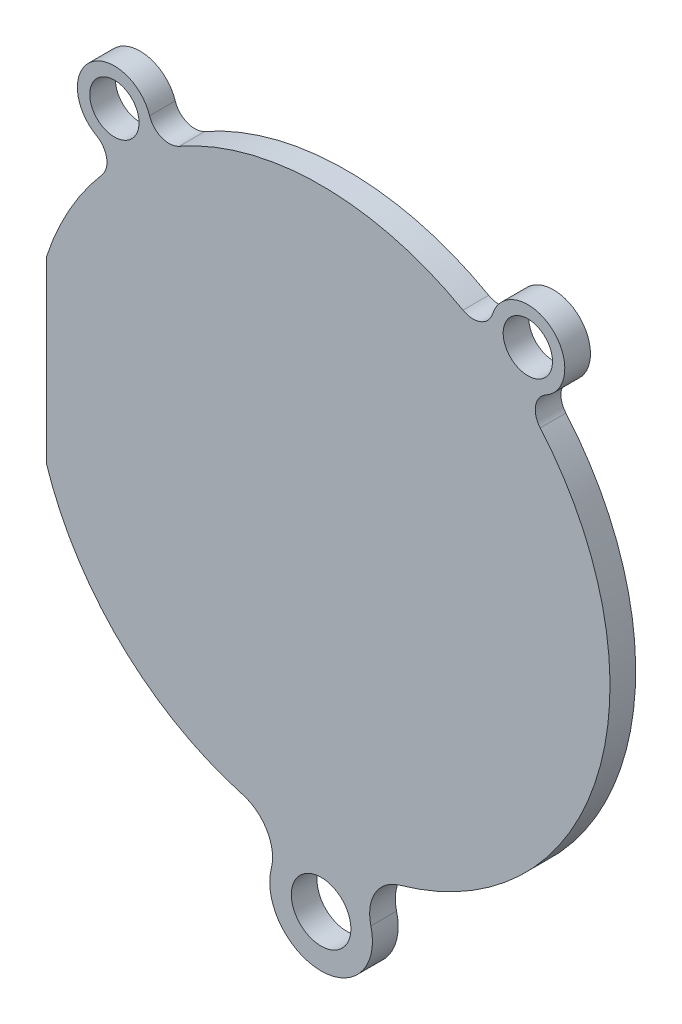
ISO-10303-21;
HEADER;
FILE_DESCRIPTION(('STEP AP214'),'2;1');
FILE_NAME('part.step','',(''),(''),'','','');
FILE_SCHEMA(('AUTOMOTIVE_DESIGN { 1 0 10303 214 1 1 1 1 }'));
ENDSEC;
DATA;
#1=APPLICATION_CONTEXT('core data for automotive mechanical design processes');
#2=APPLICATION_PROTOCOL_DEFINITION('international standard','automotive_design',2000,#1);
#3=PRODUCT_CONTEXT('',#1,'mechanical');
#4=PRODUCT('Part','Part','',(#3));
#5=PRODUCT_RELATED_PRODUCT_CATEGORY('part','',(#4));
#6=PRODUCT_DEFINITION_FORMATION('','',#4);
#7=PRODUCT_DEFINITION_CONTEXT('part definition',#1,'design');
#8=PRODUCT_DEFINITION('design','',#6,#7);
#9=PRODUCT_DEFINITION_SHAPE('','',#8);
#10=(LENGTH_UNIT() NAMED_UNIT(*) SI_UNIT(.MILLI.,.METRE.));
#11=(NAMED_UNIT(*) PLANE_ANGLE_UNIT() SI_UNIT($,.RADIAN.));
#12=(NAMED_UNIT(*) SI_UNIT($,.STERADIAN.) SOLID_ANGLE_UNIT());
#13=UNCERTAINTY_MEASURE_WITH_UNIT(LENGTH_MEASURE(1.E-05),#10,'distance_accuracy_value','');
#14=(GEOMETRIC_REPRESENTATION_CONTEXT(3) GLOBAL_UNCERTAINTY_ASSIGNED_CONTEXT((#13)) GLOBAL_UNIT_ASSIGNED_CONTEXT((#10,
#11,#12)) REPRESENTATION_CONTEXT('',''));
#15=CARTESIAN_POINT('',(0.,0.,0.));
#16=DIRECTION('',(0.,0.,1.));
#17=DIRECTION('',(1.,0.,0.));
#18=AXIS2_PLACEMENT_3D('',#15,#16,#17);
#19=CARTESIAN_POINT('',(-14.509445468443,12.4672192211281,1.5875));
#20=DIRECTION('',(0.,0.,1.));
#21=DIRECTION('',(1.,0.,0.));
#22=AXIS2_PLACEMENT_3D('',#19,#20,#21);
#23=PLANE('',#22);
#24=CARTESIAN_POINT('',(-12.7793395932632,15.5739650524873,1.5875));
#25=DIRECTION('',(0.,0.,1.));
#26=DIRECTION('',(1.,0.,0.));
#27=AXIS2_PLACEMENT_3D('',#24,#25,#26);
#28=CIRCLE('',#27,1.524);
#29=CARTESIAN_POINT('',(-11.2553395932632,15.5739650524873,1.5875));
#30=VERTEX_POINT('',#29);
#31=EDGE_CURVE('E313',#30,#30,#28,.T.);
#32=ORIENTED_EDGE('',*,*,#31,.F.);
#33=EDGE_LOOP('',(#32));
#34=FACE_BOUND('',#33,.T.);
#35=CARTESIAN_POINT('',(-14.509445468443,12.4672192211281,1.5875));
#36=DIRECTION('',(0.,0.,-1.));
#37=DIRECTION('',(1.,0.,0.));
#38=AXIS2_PLACEMENT_3D('',#35,#36,#37);
#39=CIRCLE('',#38,1.27);
#40=CARTESIAN_POINT('',(-13.8915505130217,13.5767713037564,1.5875));
#41=VERTEX_POINT('',#40);
#42=CARTESIAN_POINT('',(-13.5461924936276,11.639545549619,1.5875));
#43=VERTEX_POINT('',#42);
#44=EDGE_CURVE('E193',#41,#43,#39,.T.);
#45=ORIENTED_EDGE('',*,*,#44,.T.);
#46=CARTESIAN_POINT('',(0.,0.,1.5875));
#47=DIRECTION('',(0.,0.,1.));
#48=DIRECTION('',(1.,0.,0.));
#49=AXIS2_PLACEMENT_3D('',#46,#47,#48);
#50=CIRCLE('',#49,17.8599650524873);
#51=CARTESIAN_POINT('',(-16.9840587441892,5.5245,1.5875));
#52=VERTEX_POINT('',#51);
#53=EDGE_CURVE('E111',#43,#52,#50,.T.);
#54=ORIENTED_EDGE('',*,*,#53,.T.);
#55=DIRECTION('',(0.,-1.,0.));
#56=VECTOR('',#55,1.);
#57=CARTESIAN_POINT('',(-16.9840587441893,-5.52449999999963,1.5875));
#58=LINE('',#57,#56);
#59=CARTESIAN_POINT('',(-16.9840587441893,-5.52449999999963,1.5875));
#60=VERTEX_POINT('',#59);
#61=EDGE_CURVE('E226',#52,#60,#58,.T.);
#62=ORIENTED_EDGE('',*,*,#61,.T.);
#63=CARTESIAN_POINT('',(0.,0.,1.5875));
#64=DIRECTION('',(0.,0.,1.));
#65=DIRECTION('',(1.,0.,0.));
#66=AXIS2_PLACEMENT_3D('',#63,#64,#65);
#67=CIRCLE('',#66,17.8599650524873);
#68=CARTESIAN_POINT('',(-4.85058295667171,-17.1886647723584,1.5875));
#69=VERTEX_POINT('',#68);
#70=EDGE_CURVE('E245',#60,#69,#67,.T.);
#71=ORIENTED_EDGE('',*,*,#70,.T.);
#72=CARTESIAN_POINT('',(-5.54042085242001,-19.6331941089771,1.5875));
#73=DIRECTION('',(0.,0.,-1.));
#74=DIRECTION('',(1.,0.,0.));
#75=AXIS2_PLACEMENT_3D('',#72,#73,#74);
#76=CIRCLE('',#75,2.54);
#77=CARTESIAN_POINT('',(-3.07801158467778,-20.2562034172039,1.5875));
#78=VERTEX_POINT('',#77);
#79=EDGE_CURVE('E242',#69,#78,#76,.T.);
#80=ORIENTED_EDGE('',*,*,#79,.T.);
#81=CARTESIAN_POINT('',(0.,-21.0349650524873,1.5875));
#82=DIRECTION('',(0.,0.,1.));
#83=DIRECTION('',(1.,0.,0.));
#84=AXIS2_PLACEMENT_3D('',#81,#82,#83);
#85=CIRCLE('',#84,3.175);
#86=CARTESIAN_POINT('',(3.07801158467779,-20.2562034172039,1.5875));
#87=VERTEX_POINT('',#86);
#88=EDGE_CURVE('E244',#78,#87,#85,.T.);
#89=ORIENTED_EDGE('',*,*,#88,.T.);
#90=CARTESIAN_POINT('',(5.54042085242001,-19.6331941089771,1.5875));
#91=DIRECTION('',(0.,0.,-1.));
#92=DIRECTION('',(1.,0.,0.));
#93=AXIS2_PLACEMENT_3D('',#90,#91,#92);
#94=CIRCLE('',#93,2.54);
#95=CARTESIAN_POINT('',(4.85058295667171,-17.1886647723584,1.5875));
#96=VERTEX_POINT('',#95);
#97=EDGE_CURVE('E247',#87,#96,#94,.T.);
#98=ORIENTED_EDGE('',*,*,#97,.T.);
#99=CARTESIAN_POINT('',(0.,0.,1.5875));
#100=DIRECTION('',(0.,0.,1.));
#101=DIRECTION('',(1.,0.,0.));
#102=AXIS2_PLACEMENT_3D('',#99,#100,#101);
#103=CIRCLE('',#102,17.8599650524873);
#104=CARTESIAN_POINT('',(13.5461924936276,11.639545549619,1.5875));
#105=VERTEX_POINT('',#104);
#106=EDGE_CURVE('E253',#96,#105,#103,.T.);
#107=ORIENTED_EDGE('',*,*,#106,.T.);
#108=CARTESIAN_POINT('',(14.509445468443,12.4672192211281,1.5875));
#109=DIRECTION('',(0.,0.,-1.));
#110=DIRECTION('',(1.,0.,0.));
#111=AXIS2_PLACEMENT_3D('',#108,#109,#110);
#112=CIRCLE('',#111,1.27);
#113=CARTESIAN_POINT('',(13.8915505130217,13.5767713037564,1.5875));
#114=VERTEX_POINT('',#113);
#115=EDGE_CURVE('E255',#105,#114,#112,.T.);
#116=ORIENTED_EDGE('',*,*,#115,.T.);
#117=CARTESIAN_POINT('',(12.7793395932632,15.5739650524873,1.5875));
#118=DIRECTION('',(0.,0.,1.));
#119=DIRECTION('',(1.,0.,0.));
#120=AXIS2_PLACEMENT_3D('',#117,#118,#119);
#121=CIRCLE('',#120,2.286);
#122=CARTESIAN_POINT('',(10.6034384604149,16.2748575264587,1.5875));
#123=VERTEX_POINT('',#122);
#124=EDGE_CURVE('E257',#114,#123,#121,.T.);
#125=ORIENTED_EDGE('',*,*,#124,.T.);
#126=CARTESIAN_POINT('',(9.39460449772145,16.6642422342205,1.5875));
#127=DIRECTION('',(0.,0.,-1.));
#128=DIRECTION('',(1.,0.,0.));
#129=AXIS2_PLACEMENT_3D('',#126,#127,#128);
#130=CIRCLE('',#129,1.27);
#131=CARTESIAN_POINT('',(8.77091555321107,15.5579366252247,1.5875));
#132=VERTEX_POINT('',#131);
#133=EDGE_CURVE('E148',#123,#132,#130,.T.);
#134=ORIENTED_EDGE('',*,*,#133,.T.);
#135=CARTESIAN_POINT('',(0.,0.,1.5875));
#136=DIRECTION('',(0.,0.,1.));
#137=DIRECTION('',(1.,0.,0.));
#138=AXIS2_PLACEMENT_3D('',#135,#136,#137);
#139=CIRCLE('',#138,17.8599650524873);
#140=CARTESIAN_POINT('',(-8.77091555321107,15.5579366252247,1.5875));
#141=VERTEX_POINT('',#140);
#142=EDGE_CURVE('E142',#132,#141,#139,.T.);
#143=ORIENTED_EDGE('',*,*,#142,.T.);
#144=CARTESIAN_POINT('',(-9.39460449772145,16.6642422342205,1.5875));
#145=DIRECTION('',(0.,0.,-1.));
#146=DIRECTION('',(1.,0.,0.));
#147=AXIS2_PLACEMENT_3D('',#144,#145,#146);
#148=CIRCLE('',#147,1.27);
#149=CARTESIAN_POINT('',(-10.6034384604149,16.2748575264587,1.5875));
#150=VERTEX_POINT('',#149);
#151=EDGE_CURVE('E146',#141,#150,#148,.T.);
#152=ORIENTED_EDGE('',*,*,#151,.T.);
#153=CARTESIAN_POINT('',(-12.7793395932632,15.5739650524873,1.5875));
#154=DIRECTION('',(0.,0.,1.));
#155=DIRECTION('',(1.,0.,0.));
#156=AXIS2_PLACEMENT_3D('',#153,#154,#155);
#157=CIRCLE('',#156,2.286);
#158=EDGE_CURVE('E50',#150,#41,#157,.T.);
#159=ORIENTED_EDGE('',*,*,#158,.T.);
#160=EDGE_LOOP('',(#45,#54,#62,#71,#80,#89,#98,#107,#116,#125,#134,#143,#152,#159));
#161=FACE_BOUND('',#160,.T.);
#162=CARTESIAN_POINT('',(0.,-21.0349650524873,1.5875));
#163=DIRECTION('',(0.,0.,1.));
#164=DIRECTION('',(1.,0.,0.));
#165=AXIS2_PLACEMENT_3D('',#162,#163,#164);
#166=CIRCLE('',#165,1.8415);
#167=CARTESIAN_POINT('',(1.8415,-21.0349650524873,1.5875));
#168=VERTEX_POINT('',#167);
#169=EDGE_CURVE('E170',#168,#168,#166,.T.);
#170=ORIENTED_EDGE('',*,*,#169,.F.);
#171=EDGE_LOOP('',(#170));
#172=FACE_BOUND('',#171,.T.);
#173=CARTESIAN_POINT('',(12.7793395932632,15.5739650524873,1.5875));
#174=DIRECTION('',(0.,0.,1.));
#175=DIRECTION('',(1.,0.,0.));
#176=AXIS2_PLACEMENT_3D('',#173,#174,#175);
#177=CIRCLE('',#176,1.524);
#178=CARTESIAN_POINT('',(14.3033395932632,15.5739650524873,1.5875));
#179=VERTEX_POINT('',#178);
#180=EDGE_CURVE('E304',#179,#179,#177,.T.);
#181=ORIENTED_EDGE('',*,*,#180,.F.);
#182=EDGE_LOOP('',(#181));
#183=FACE_BOUND('',#182,.T.);
#184=ADVANCED_FACE('F33',(#34,#161,#172,#183),#23,.T.);
#185=CARTESIAN_POINT('',(-14.509445468443,12.4672192211281,0.));
#186=DIRECTION('',(0.,0.,1.));
#187=DIRECTION('',(1.,0.,0.));
#188=AXIS2_PLACEMENT_3D('',#185,#186,#187);
#189=PLANE('',#188);
#190=CARTESIAN_POINT('',(-12.7793395932632,15.5739650524873,0.));
#191=DIRECTION('',(0.,0.,1.));
#192=DIRECTION('',(1.,0.,0.));
#193=AXIS2_PLACEMENT_3D('',#190,#191,#192);
#194=CIRCLE('',#193,1.524);
#195=CARTESIAN_POINT('',(-11.2553395932632,15.5739650524873,0.));
#196=VERTEX_POINT('',#195);
#197=EDGE_CURVE('E310',#196,#196,#194,.T.);
#198=ORIENTED_EDGE('',*,*,#197,.T.);
#199=EDGE_LOOP('',(#198));
#200=FACE_BOUND('',#199,.T.);
#201=CARTESIAN_POINT('',(-14.509445468443,12.4672192211281,0.));
#202=DIRECTION('',(0.,0.,-1.));
#203=DIRECTION('',(1.,0.,0.));
#204=AXIS2_PLACEMENT_3D('',#201,#202,#203);
#205=CIRCLE('',#204,1.27);
#206=CARTESIAN_POINT('',(-13.8915505130217,13.5767713037564,0.));
#207=VERTEX_POINT('',#206);
#208=CARTESIAN_POINT('',(-13.5461924936276,11.639545549619,0.));
#209=VERTEX_POINT('',#208);
#210=EDGE_CURVE('E166',#207,#209,#205,.T.);
#211=ORIENTED_EDGE('',*,*,#210,.F.);
#212=CARTESIAN_POINT('',(-12.7793395932632,15.5739650524873,0.));
#213=DIRECTION('',(0.,0.,1.));
#214=DIRECTION('',(1.,0.,0.));
#215=AXIS2_PLACEMENT_3D('',#212,#213,#214);
#216=CIRCLE('',#215,2.286);
#217=CARTESIAN_POINT('',(-10.6034384604149,16.2748575264587,0.));
#218=VERTEX_POINT('',#217);
#219=EDGE_CURVE('E103',#218,#207,#216,.T.);
#220=ORIENTED_EDGE('',*,*,#219,.F.);
#221=CARTESIAN_POINT('',(-9.39460449772145,16.6642422342205,0.));
#222=DIRECTION('',(0.,0.,-1.));
#223=DIRECTION('',(1.,0.,0.));
#224=AXIS2_PLACEMENT_3D('',#221,#222,#223);
#225=CIRCLE('',#224,1.27);
#226=CARTESIAN_POINT('',(-8.77091555321107,15.5579366252247,0.));
#227=VERTEX_POINT('',#226);
#228=EDGE_CURVE('E97',#227,#218,#225,.T.);
#229=ORIENTED_EDGE('',*,*,#228,.F.);
#230=CARTESIAN_POINT('',(0.,0.,0.));
#231=DIRECTION('',(0.,0.,1.));
#232=DIRECTION('',(1.,0.,0.));
#233=AXIS2_PLACEMENT_3D('',#230,#231,#232);
#234=CIRCLE('',#233,17.8599650524873);
#235=CARTESIAN_POINT('',(8.77091555321107,15.5579366252247,0.));
#236=VERTEX_POINT('',#235);
#237=EDGE_CURVE('E156',#236,#227,#234,.T.);
#238=ORIENTED_EDGE('',*,*,#237,.F.);
#239=CARTESIAN_POINT('',(9.39460449772145,16.6642422342205,0.));
#240=DIRECTION('',(0.,0.,-1.));
#241=DIRECTION('',(1.,0.,0.));
#242=AXIS2_PLACEMENT_3D('',#239,#240,#241);
#243=CIRCLE('',#242,1.27);
#244=CARTESIAN_POINT('',(10.6034384604149,16.2748575264587,0.));
#245=VERTEX_POINT('',#244);
#246=EDGE_CURVE('E188',#245,#236,#243,.T.);
#247=ORIENTED_EDGE('',*,*,#246,.F.);
#248=CARTESIAN_POINT('',(12.7793395932632,15.5739650524873,0.));
#249=DIRECTION('',(0.,0.,1.));
#250=DIRECTION('',(1.,0.,0.));
#251=AXIS2_PLACEMENT_3D('',#248,#249,#250);
#252=CIRCLE('',#251,2.286);
#253=CARTESIAN_POINT('',(13.8915505130217,13.5767713037564,0.));
#254=VERTEX_POINT('',#253);
#255=EDGE_CURVE('E186',#254,#245,#252,.T.);
#256=ORIENTED_EDGE('',*,*,#255,.F.);
#257=CARTESIAN_POINT('',(14.509445468443,12.4672192211281,0.));
#258=DIRECTION('',(0.,0.,-1.));
#259=DIRECTION('',(1.,0.,0.));
#260=AXIS2_PLACEMENT_3D('',#257,#258,#259);
#261=CIRCLE('',#260,1.27);
#262=CARTESIAN_POINT('',(13.5461924936276,11.639545549619,0.));
#263=VERTEX_POINT('',#262);
#264=EDGE_CURVE('E184',#263,#254,#261,.T.);
#265=ORIENTED_EDGE('',*,*,#264,.F.);
#266=CARTESIAN_POINT('',(0.,0.,0.));
#267=DIRECTION('',(0.,0.,1.));
#268=DIRECTION('',(1.,0.,0.));
#269=AXIS2_PLACEMENT_3D('',#266,#267,#268);
#270=CIRCLE('',#269,17.8599650524873);
#271=CARTESIAN_POINT('',(4.85058295667171,-17.1886647723584,0.));
#272=VERTEX_POINT('',#271);
#273=EDGE_CURVE('E182',#272,#263,#270,.T.);
#274=ORIENTED_EDGE('',*,*,#273,.F.);
#275=CARTESIAN_POINT('',(5.54042085242001,-19.6331941089771,0.));
#276=DIRECTION('',(0.,0.,-1.));
#277=DIRECTION('',(1.,0.,0.));
#278=AXIS2_PLACEMENT_3D('',#275,#276,#277);
#279=CIRCLE('',#278,2.54);
#280=CARTESIAN_POINT('',(3.07801158467779,-20.2562034172039,0.));
#281=VERTEX_POINT('',#280);
#282=EDGE_CURVE('E180',#281,#272,#279,.T.);
#283=ORIENTED_EDGE('',*,*,#282,.F.);
#284=CARTESIAN_POINT('',(0.,-21.0349650524873,0.));
#285=DIRECTION('',(0.,0.,1.));
#286=DIRECTION('',(1.,0.,0.));
#287=AXIS2_PLACEMENT_3D('',#284,#285,#286);
#288=CIRCLE('',#287,3.175);
#289=CARTESIAN_POINT('',(-3.07801158467778,-20.2562034172039,0.));
#290=VERTEX_POINT('',#289);
#291=EDGE_CURVE('E178',#290,#281,#288,.T.);
#292=ORIENTED_EDGE('',*,*,#291,.F.);
#293=CARTESIAN_POINT('',(-5.54042085242001,-19.6331941089771,0.));
#294=DIRECTION('',(0.,0.,-1.));
#295=DIRECTION('',(1.,0.,0.));
#296=AXIS2_PLACEMENT_3D('',#293,#294,#295);
#297=CIRCLE('',#296,2.54);
#298=CARTESIAN_POINT('',(-4.85058295667171,-17.1886647723584,0.));
#299=VERTEX_POINT('',#298);
#300=EDGE_CURVE('E176',#299,#290,#297,.T.);
#301=ORIENTED_EDGE('',*,*,#300,.F.);
#302=CARTESIAN_POINT('',(0.,0.,0.));
#303=DIRECTION('',(0.,0.,1.));
#304=DIRECTION('',(1.,0.,0.));
#305=AXIS2_PLACEMENT_3D('',#302,#303,#304);
#306=CIRCLE('',#305,17.8599650524873);
#307=CARTESIAN_POINT('',(-16.9840587441893,-5.52449999999963,0.));
#308=VERTEX_POINT('',#307);
#309=EDGE_CURVE('E174',#308,#299,#306,.T.);
#310=ORIENTED_EDGE('',*,*,#309,.F.);
#311=DIRECTION('',(0.,-1.,0.));
#312=VECTOR('',#311,1.);
#313=CARTESIAN_POINT('',(-16.9840587441893,-5.52449999999963,0.));
#314=LINE('',#313,#312);
#315=CARTESIAN_POINT('',(-16.9840587441892,5.5245,0.));
#316=VERTEX_POINT('',#315);
#317=EDGE_CURVE('E172',#316,#308,#314,.T.);
#318=ORIENTED_EDGE('',*,*,#317,.F.);
#319=CARTESIAN_POINT('',(0.,0.,0.));
#320=DIRECTION('',(0.,0.,1.));
#321=DIRECTION('',(1.,0.,0.));
#322=AXIS2_PLACEMENT_3D('',#319,#320,#321);
#323=CIRCLE('',#322,17.8599650524873);
#324=EDGE_CURVE('E169',#209,#316,#323,.T.);
#325=ORIENTED_EDGE('',*,*,#324,.F.);
#326=EDGE_LOOP('',(#211,#220,#229,#238,#247,#256,#265,#274,#283,#292,#301,#310,#318,#325));
#327=FACE_BOUND('',#326,.T.);
#328=CARTESIAN_POINT('',(0.,-21.0349650524873,0.));
#329=DIRECTION('',(0.,0.,1.));
#330=DIRECTION('',(1.,0.,0.));
#331=AXIS2_PLACEMENT_3D('',#328,#329,#330);
#332=CIRCLE('',#331,1.8415);
#333=CARTESIAN_POINT('',(1.8415,-21.0349650524873,0.));
#334=VERTEX_POINT('',#333);
#335=EDGE_CURVE('E316',#334,#334,#332,.T.);
#336=ORIENTED_EDGE('',*,*,#335,.T.);
#337=EDGE_LOOP('',(#336));
#338=FACE_BOUND('',#337,.T.);
#339=CARTESIAN_POINT('',(12.7793395932632,15.5739650524873,0.));
#340=DIRECTION('',(0.,0.,1.));
#341=DIRECTION('',(1.,0.,0.));
#342=AXIS2_PLACEMENT_3D('',#339,#340,#341);
#343=CIRCLE('',#342,1.524);
#344=CARTESIAN_POINT('',(14.3033395932632,15.5739650524873,0.));
#345=VERTEX_POINT('',#344);
#346=EDGE_CURVE('E307',#345,#345,#343,.T.);
#347=ORIENTED_EDGE('',*,*,#346,.T.);
#348=EDGE_LOOP('',(#347));
#349=FACE_BOUND('',#348,.T.);
#350=ADVANCED_FACE('F230',(#200,#327,#338,#349),#189,.F.);
#351=CARTESIAN_POINT('',(-14.509445468443,12.4672192211281,1.5875));
#352=DIRECTION('',(0.,0.,-1.));
#353=DIRECTION('',(-1.,0.,0.));
#354=AXIS2_PLACEMENT_3D('',#351,#352,#353);
#355=CYLINDRICAL_SURFACE('',#354,1.27);
#356=ORIENTED_EDGE('',*,*,#210,.T.);
#357=DIRECTION('',(0.,0.,-1.));
#358=VECTOR('',#357,1.);
#359=CARTESIAN_POINT('',(-13.5461924936276,11.639545549619,1.5875));
#360=LINE('',#359,#358);
#361=EDGE_CURVE('E11',#43,#209,#360,.T.);
#362=ORIENTED_EDGE('',*,*,#361,.F.);
#363=ORIENTED_EDGE('',*,*,#44,.F.);
#364=DIRECTION('',(0.,0.,-1.));
#365=VECTOR('',#364,1.);
#366=CARTESIAN_POINT('',(-13.8915505130217,13.5767713037564,1.5875));
#367=LINE('',#366,#365);
#368=EDGE_CURVE('E162',#41,#207,#367,.T.);
#369=ORIENTED_EDGE('',*,*,#368,.T.);
#370=EDGE_LOOP('',(#356,#362,#363,#369));
#371=FACE_BOUND('',#370,.T.);
#372=ADVANCED_FACE('F35',(#371),#355,.F.);
#373=CARTESIAN_POINT('',(0.,0.,1.5875));
#374=DIRECTION('',(0.,0.,-1.));
#375=DIRECTION('',(-1.,0.,0.));
#376=AXIS2_PLACEMENT_3D('',#373,#374,#375);
#377=CYLINDRICAL_SURFACE('',#376,17.8599650524873);
#378=ORIENTED_EDGE('',*,*,#324,.T.);
#379=DIRECTION('',(0.,0.,-1.));
#380=VECTOR('',#379,1.);
#381=CARTESIAN_POINT('',(-16.9840587441892,5.5245,1.5875));
#382=LINE('',#381,#380);
#383=EDGE_CURVE('E42',#52,#316,#382,.T.);
#384=ORIENTED_EDGE('',*,*,#383,.F.);
#385=ORIENTED_EDGE('',*,*,#53,.F.);
#386=ORIENTED_EDGE('',*,*,#361,.T.);
#387=EDGE_LOOP('',(#378,#384,#385,#386));
#388=FACE_BOUND('',#387,.T.);
#389=ADVANCED_FACE('F437',(#388),#377,.T.);
#390=CARTESIAN_POINT('',(-16.9840587441893,-5.52449999999963,1.5875));
#391=DIRECTION('',(1.,0.,0.));
#392=DIRECTION('',(0.,1.,0.));
#393=AXIS2_PLACEMENT_3D('',#390,#391,#392);
#394=PLANE('',#393);
#395=ORIENTED_EDGE('',*,*,#317,.T.);
#396=DIRECTION('',(0.,0.,-1.));
#397=VECTOR('',#396,1.);
#398=CARTESIAN_POINT('',(-16.9840587441893,-5.52449999999963,1.5875));
#399=LINE('',#398,#397);
#400=EDGE_CURVE('E218',#60,#308,#399,.T.);
#401=ORIENTED_EDGE('',*,*,#400,.F.);
#402=ORIENTED_EDGE('',*,*,#61,.F.);
#403=ORIENTED_EDGE('',*,*,#383,.T.);
#404=EDGE_LOOP('',(#395,#401,#402,#403));
#405=FACE_BOUND('',#404,.T.);
#406=ADVANCED_FACE('F224',(#405),#394,.F.);
#407=CARTESIAN_POINT('',(0.,0.,1.5875));
#408=DIRECTION('',(0.,0.,-1.));
#409=DIRECTION('',(-1.,0.,0.));
#410=AXIS2_PLACEMENT_3D('',#407,#408,#409);
#411=CYLINDRICAL_SURFACE('',#410,17.8599650524873);
#412=ORIENTED_EDGE('',*,*,#309,.T.);
#413=DIRECTION('',(0.,0.,-1.));
#414=VECTOR('',#413,1.);
#415=CARTESIAN_POINT('',(-4.85058295667171,-17.1886647723584,1.5875));
#416=LINE('',#415,#414);
#417=EDGE_CURVE('E215',#69,#299,#416,.T.);
#418=ORIENTED_EDGE('',*,*,#417,.F.);
#419=ORIENTED_EDGE('',*,*,#70,.F.);
#420=ORIENTED_EDGE('',*,*,#400,.T.);
#421=EDGE_LOOP('',(#412,#418,#419,#420));
#422=FACE_BOUND('',#421,.T.);
#423=ADVANCED_FACE('F236',(#422),#411,.T.);
#424=CARTESIAN_POINT('',(-5.54042085242001,-19.6331941089771,1.5875));
#425=DIRECTION('',(0.,0.,-1.));
#426=DIRECTION('',(-1.,0.,0.));
#427=AXIS2_PLACEMENT_3D('',#424,#425,#426);
#428=CYLINDRICAL_SURFACE('',#427,2.54);
#429=ORIENTED_EDGE('',*,*,#300,.T.);
#430=DIRECTION('',(0.,0.,-1.));
#431=VECTOR('',#430,1.);
#432=CARTESIAN_POINT('',(-3.07801158467778,-20.2562034172039,1.5875));
#433=LINE('',#432,#431);
#434=EDGE_CURVE('E212',#78,#290,#433,.T.);
#435=ORIENTED_EDGE('',*,*,#434,.F.);
#436=ORIENTED_EDGE('',*,*,#79,.F.);
#437=ORIENTED_EDGE('',*,*,#417,.T.);
#438=EDGE_LOOP('',(#429,#435,#436,#437));
#439=FACE_BOUND('',#438,.T.);
#440=ADVANCED_FACE('F240',(#439),#428,.F.);
#441=CARTESIAN_POINT('',(0.,-21.0349650524873,1.5875));
#442=DIRECTION('',(0.,0.,-1.));
#443=DIRECTION('',(-1.,0.,0.));
#444=AXIS2_PLACEMENT_3D('',#441,#442,#443);
#445=CYLINDRICAL_SURFACE('',#444,3.175);
#446=ORIENTED_EDGE('',*,*,#291,.T.);
#447=DIRECTION('',(0.,0.,-1.));
#448=VECTOR('',#447,1.);
#449=CARTESIAN_POINT('',(3.07801158467779,-20.2562034172039,1.5875));
#450=LINE('',#449,#448);
#451=EDGE_CURVE('E209',#87,#281,#450,.T.);
#452=ORIENTED_EDGE('',*,*,#451,.F.);
#453=ORIENTED_EDGE('',*,*,#88,.F.);
#454=ORIENTED_EDGE('',*,*,#434,.T.);
#455=EDGE_LOOP('',(#446,#452,#453,#454));
#456=FACE_BOUND('',#455,.T.);
#457=ADVANCED_FACE('F402',(#456),#445,.T.);
#458=CARTESIAN_POINT('',(5.54042085242001,-19.6331941089771,1.5875));
#459=DIRECTION('',(0.,0.,-1.));
#460=DIRECTION('',(-1.,0.,0.));
#461=AXIS2_PLACEMENT_3D('',#458,#459,#460);
#462=CYLINDRICAL_SURFACE('',#461,2.54);
#463=ORIENTED_EDGE('',*,*,#282,.T.);
#464=DIRECTION('',(0.,0.,-1.));
#465=VECTOR('',#464,1.);
#466=CARTESIAN_POINT('',(4.85058295667171,-17.1886647723584,1.5875));
#467=LINE('',#466,#465);
#468=EDGE_CURVE('E206',#96,#272,#467,.T.);
#469=ORIENTED_EDGE('',*,*,#468,.F.);
#470=ORIENTED_EDGE('',*,*,#97,.F.);
#471=ORIENTED_EDGE('',*,*,#451,.T.);
#472=EDGE_LOOP('',(#463,#469,#470,#471));
#473=FACE_BOUND('',#472,.T.);
#474=ADVANCED_FACE('F392',(#473),#462,.F.);
#475=CARTESIAN_POINT('',(0.,0.,1.5875));
#476=DIRECTION('',(0.,0.,-1.));
#477=DIRECTION('',(-1.,0.,0.));
#478=AXIS2_PLACEMENT_3D('',#475,#476,#477);
#479=CYLINDRICAL_SURFACE('',#478,17.8599650524873);
#480=ORIENTED_EDGE('',*,*,#273,.T.);
#481=DIRECTION('',(0.,0.,-1.));
#482=VECTOR('',#481,1.);
#483=CARTESIAN_POINT('',(13.5461924936276,11.639545549619,1.5875));
#484=LINE('',#483,#482);
#485=EDGE_CURVE('E203',#105,#263,#484,.T.);
#486=ORIENTED_EDGE('',*,*,#485,.F.);
#487=ORIENTED_EDGE('',*,*,#106,.F.);
#488=ORIENTED_EDGE('',*,*,#468,.T.);
#489=EDGE_LOOP('',(#480,#486,#487,#488));
#490=FACE_BOUND('',#489,.T.);
#491=ADVANCED_FACE('F382',(#490),#479,.T.);
#492=CARTESIAN_POINT('',(14.509445468443,12.4672192211281,1.5875));
#493=DIRECTION('',(0.,0.,-1.));
#494=DIRECTION('',(-1.,0.,0.));
#495=AXIS2_PLACEMENT_3D('',#492,#493,#494);
#496=CYLINDRICAL_SURFACE('',#495,1.27);
#497=ORIENTED_EDGE('',*,*,#264,.T.);
#498=DIRECTION('',(0.,0.,-1.));
#499=VECTOR('',#498,1.);
#500=CARTESIAN_POINT('',(13.8915505130217,13.5767713037564,1.5875));
#501=LINE('',#500,#499);
#502=EDGE_CURVE('E200',#114,#254,#501,.T.);
#503=ORIENTED_EDGE('',*,*,#502,.F.);
#504=ORIENTED_EDGE('',*,*,#115,.F.);
#505=ORIENTED_EDGE('',*,*,#485,.T.);
#506=EDGE_LOOP('',(#497,#503,#504,#505));
#507=FACE_BOUND('',#506,.T.);
#508=ADVANCED_FACE('F373',(#507),#496,.F.);
#509=CARTESIAN_POINT('',(12.7793395932632,15.5739650524873,1.5875));
#510=DIRECTION('',(0.,0.,-1.));
#511=DIRECTION('',(-1.,0.,0.));
#512=AXIS2_PLACEMENT_3D('',#509,#510,#511);
#513=CYLINDRICAL_SURFACE('',#512,2.286);
#514=ORIENTED_EDGE('',*,*,#255,.T.);
#515=DIRECTION('',(0.,0.,-1.));
#516=VECTOR('',#515,1.);
#517=CARTESIAN_POINT('',(10.6034384604149,16.2748575264587,1.5875));
#518=LINE('',#517,#516);
#519=EDGE_CURVE('E197',#123,#245,#518,.T.);
#520=ORIENTED_EDGE('',*,*,#519,.F.);
#521=ORIENTED_EDGE('',*,*,#124,.F.);
#522=ORIENTED_EDGE('',*,*,#502,.T.);
#523=EDGE_LOOP('',(#514,#520,#521,#522));
#524=FACE_BOUND('',#523,.T.);
#525=ADVANCED_FACE('F263',(#524),#513,.T.);
#526=CARTESIAN_POINT('',(9.39460449772145,16.6642422342205,1.5875));
#527=DIRECTION('',(0.,0.,-1.));
#528=DIRECTION('',(-1.,0.,0.));
#529=AXIS2_PLACEMENT_3D('',#526,#527,#528);
#530=CYLINDRICAL_SURFACE('',#529,1.27);
#531=ORIENTED_EDGE('',*,*,#246,.T.);
#532=DIRECTION('',(0.,0.,-1.));
#533=VECTOR('',#532,1.);
#534=CARTESIAN_POINT('',(8.77091555321107,15.5579366252247,1.5875));
#535=LINE('',#534,#533);
#536=EDGE_CURVE('E157',#132,#236,#535,.T.);
#537=ORIENTED_EDGE('',*,*,#536,.F.);
#538=ORIENTED_EDGE('',*,*,#133,.F.);
#539=ORIENTED_EDGE('',*,*,#519,.T.);
#540=EDGE_LOOP('',(#531,#537,#538,#539));
#541=FACE_BOUND('',#540,.T.);
#542=ADVANCED_FACE('F267',(#541),#530,.F.);
#543=CARTESIAN_POINT('',(0.,0.,1.5875));
#544=DIRECTION('',(0.,0.,-1.));
#545=DIRECTION('',(-1.,0.,0.));
#546=AXIS2_PLACEMENT_3D('',#543,#544,#545);
#547=CYLINDRICAL_SURFACE('',#546,17.8599650524873);
#548=ORIENTED_EDGE('',*,*,#237,.T.);
#549=DIRECTION('',(0.,0.,-1.));
#550=VECTOR('',#549,1.);
#551=CARTESIAN_POINT('',(-8.77091555321107,15.5579366252247,1.5875));
#552=LINE('',#551,#550);
#553=EDGE_CURVE('E153',#141,#227,#552,.T.);
#554=ORIENTED_EDGE('',*,*,#553,.F.);
#555=ORIENTED_EDGE('',*,*,#142,.F.);
#556=ORIENTED_EDGE('',*,*,#536,.T.);
#557=EDGE_LOOP('',(#548,#554,#555,#556));
#558=FACE_BOUND('',#557,.T.);
#559=ADVANCED_FACE('F154',(#558),#547,.T.);
#560=CARTESIAN_POINT('',(-9.39460449772145,16.6642422342205,1.5875));
#561=DIRECTION('',(0.,0.,-1.));
#562=DIRECTION('',(-1.,0.,0.));
#563=AXIS2_PLACEMENT_3D('',#560,#561,#562);
#564=CYLINDRICAL_SURFACE('',#563,1.27);
#565=ORIENTED_EDGE('',*,*,#228,.T.);
#566=DIRECTION('',(0.,0.,-1.));
#567=VECTOR('',#566,1.);
#568=CARTESIAN_POINT('',(-10.6034384604149,16.2748575264587,1.5875));
#569=LINE('',#568,#567);
#570=EDGE_CURVE('E158',#150,#218,#569,.T.);
#571=ORIENTED_EDGE('',*,*,#570,.F.);
#572=ORIENTED_EDGE('',*,*,#151,.F.);
#573=ORIENTED_EDGE('',*,*,#553,.T.);
#574=EDGE_LOOP('',(#565,#571,#572,#573));
#575=FACE_BOUND('',#574,.T.);
#576=ADVANCED_FACE('F160',(#575),#564,.F.);
#577=CARTESIAN_POINT('',(-12.7793395932632,15.5739650524873,1.5875));
#578=DIRECTION('',(0.,0.,-1.));
#579=DIRECTION('',(-1.,0.,0.));
#580=AXIS2_PLACEMENT_3D('',#577,#578,#579);
#581=CYLINDRICAL_SURFACE('',#580,2.286);
#582=ORIENTED_EDGE('',*,*,#219,.T.);
#583=ORIENTED_EDGE('',*,*,#368,.F.);
#584=ORIENTED_EDGE('',*,*,#158,.F.);
#585=ORIENTED_EDGE('',*,*,#570,.T.);
#586=EDGE_LOOP('',(#582,#583,#584,#585));
#587=FACE_BOUND('',#586,.T.);
#588=ADVANCED_FACE('F271',(#587),#581,.T.);
#589=CARTESIAN_POINT('',(0.,-21.0349650524873,1.5875));
#590=DIRECTION('',(0.,0.,-1.));
#591=DIRECTION('',(-1.,0.,0.));
#592=AXIS2_PLACEMENT_3D('',#589,#590,#591);
#593=CYLINDRICAL_SURFACE('',#592,1.8415);
#594=ORIENTED_EDGE('',*,*,#169,.T.);
#595=EDGE_LOOP('',(#594));
#596=FACE_BOUND('',#595,.T.);
#597=ORIENTED_EDGE('',*,*,#335,.F.);
#598=EDGE_LOOP('',(#597));
#599=FACE_BOUND('',#598,.T.);
#600=ADVANCED_FACE('F273',(#596,#599),#593,.F.);
#601=CARTESIAN_POINT('',(-12.7793395932632,15.5739650524873,1.5875));
#602=DIRECTION('',(0.,0.,-1.));
#603=DIRECTION('',(-1.,0.,0.));
#604=AXIS2_PLACEMENT_3D('',#601,#602,#603);
#605=CYLINDRICAL_SURFACE('',#604,1.524);
#606=ORIENTED_EDGE('',*,*,#31,.T.);
#607=EDGE_LOOP('',(#606));
#608=FACE_BOUND('',#607,.T.);
#609=ORIENTED_EDGE('',*,*,#197,.F.);
#610=EDGE_LOOP('',(#609));
#611=FACE_BOUND('',#610,.T.);
#612=ADVANCED_FACE('F279',(#608,#611),#605,.F.);
#613=CARTESIAN_POINT('',(12.7793395932632,15.5739650524873,1.5875));
#614=DIRECTION('',(0.,0.,-1.));
#615=DIRECTION('',(-1.,0.,0.));
#616=AXIS2_PLACEMENT_3D('',#613,#614,#615);
#617=CYLINDRICAL_SURFACE('',#616,1.524);
#618=ORIENTED_EDGE('',*,*,#180,.T.);
#619=EDGE_LOOP('',(#618));
#620=FACE_BOUND('',#619,.T.);
#621=ORIENTED_EDGE('',*,*,#346,.F.);
#622=EDGE_LOOP('',(#621));
#623=FACE_BOUND('',#622,.T.);
#624=ADVANCED_FACE('F295',(#620,#623),#617,.F.);
#625=CLOSED_SHELL('',(#184,#350,#372,#389,#406,#423,#440,#457,#474,#491,#508,#525,#542,#559,
#576,#588,#600,#612,#624));
#626=MANIFOLD_SOLID_BREP('B2',#625);
#627=ADVANCED_BREP_SHAPE_REPRESENTATION('',(#18,#626),#14);
#628=SHAPE_DEFINITION_REPRESENTATION(#9,#627);
ENDSEC;
END-ISO-10303-21;
